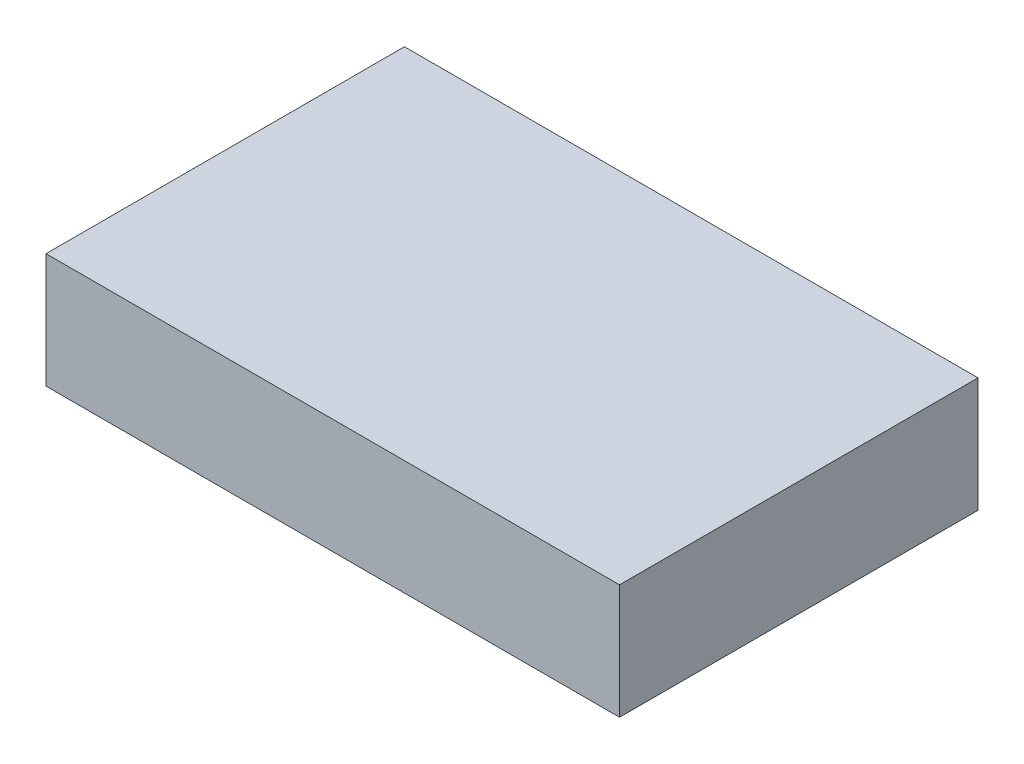
ISO-10303-21;
HEADER;
FILE_DESCRIPTION(('STEP AP214'),'2;1');
FILE_NAME('part.step','',(''),(''),'','','');
FILE_SCHEMA(('AUTOMOTIVE_DESIGN { 1 0 10303 214 1 1 1 1 }'));
ENDSEC;
DATA;
#1=APPLICATION_CONTEXT('core data for automotive mechanical design processes');
#2=APPLICATION_PROTOCOL_DEFINITION('international standard','automotive_design',2000,#1);
#3=PRODUCT_CONTEXT('',#1,'mechanical');
#4=PRODUCT('Part','Part','',(#3));
#5=PRODUCT_RELATED_PRODUCT_CATEGORY('part','',(#4));
#6=PRODUCT_DEFINITION_FORMATION('','',#4);
#7=PRODUCT_DEFINITION_CONTEXT('part definition',#1,'design');
#8=PRODUCT_DEFINITION('design','',#6,#7);
#9=PRODUCT_DEFINITION_SHAPE('','',#8);
#10=(LENGTH_UNIT() NAMED_UNIT(*) SI_UNIT(.MILLI.,.METRE.));
#11=(NAMED_UNIT(*) PLANE_ANGLE_UNIT() SI_UNIT($,.RADIAN.));
#12=(NAMED_UNIT(*) SI_UNIT($,.STERADIAN.) SOLID_ANGLE_UNIT());
#13=UNCERTAINTY_MEASURE_WITH_UNIT(LENGTH_MEASURE(1.E-05),#10,'distance_accuracy_value','');
#14=(GEOMETRIC_REPRESENTATION_CONTEXT(3) GLOBAL_UNCERTAINTY_ASSIGNED_CONTEXT((#13)) GLOBAL_UNIT_ASSIGNED_CONTEXT((#10,
#11,#12)) REPRESENTATION_CONTEXT('',''));
#15=CARTESIAN_POINT('',(0.,0.,0.));
#16=DIRECTION('',(0.,0.,1.));
#17=DIRECTION('',(1.,0.,0.));
#18=AXIS2_PLACEMENT_3D('',#15,#16,#17);
#19=CARTESIAN_POINT('',(0.,3.705,0.));
#20=DIRECTION('',(0.,1.,0.));
#21=DIRECTION('',(1.,0.,0.));
#22=AXIS2_PLACEMENT_3D('',#19,#20,#21);
#23=PLANE('',#22);
#24=DIRECTION('',(-1.,0.,0.));
#25=VECTOR('',#24,1.);
#26=CARTESIAN_POINT('',(0.,3.705,1.861));
#27=LINE('',#26,#25);
#28=CARTESIAN_POINT('',(-13.73,3.705,1.861));
#29=VERTEX_POINT('',#28);
#30=CARTESIAN_POINT('',(-15.73,3.705,1.861));
#31=VERTEX_POINT('',#30);
#32=EDGE_CURVE('E11',#29,#31,#27,.T.);
#33=ORIENTED_EDGE('',*,*,#32,.T.);
#34=DIRECTION('',(0.,0.,1.));
#35=VECTOR('',#34,1.);
#36=CARTESIAN_POINT('',(-15.73,3.705,0.));
#37=LINE('',#36,#35);
#38=CARTESIAN_POINT('',(-15.73,3.705,3.111));
#39=VERTEX_POINT('',#38);
#40=EDGE_CURVE('E24',#31,#39,#37,.T.);
#41=ORIENTED_EDGE('',*,*,#40,.T.);
#42=DIRECTION('',(1.,0.,0.));
#43=VECTOR('',#42,1.);
#44=CARTESIAN_POINT('',(0.,3.705,3.111));
#45=LINE('',#44,#43);
#46=CARTESIAN_POINT('',(-13.73,3.705,3.111));
#47=VERTEX_POINT('',#46);
#48=EDGE_CURVE('E88',#39,#47,#45,.T.);
#49=ORIENTED_EDGE('',*,*,#48,.T.);
#50=DIRECTION('',(0.,0.,-1.));
#51=VECTOR('',#50,1.);
#52=CARTESIAN_POINT('',(-13.73,3.705,0.));
#53=LINE('',#52,#51);
#54=EDGE_CURVE('E59',#47,#29,#53,.T.);
#55=ORIENTED_EDGE('',*,*,#54,.T.);
#56=EDGE_LOOP('',(#33,#41,#49,#55));
#57=FACE_BOUND('',#56,.T.);
#58=ADVANCED_FACE('F17',(#57),#23,.T.);
#59=CARTESIAN_POINT('',(-15.73,3.705,1.861));
#60=DIRECTION('',(1.,0.,0.));
#61=DIRECTION('',(0.,1.,0.));
#62=AXIS2_PLACEMENT_3D('',#59,#60,#61);
#63=PLANE('',#62);
#64=DIRECTION('',(0.,-1.,0.));
#65=VECTOR('',#64,1.);
#66=CARTESIAN_POINT('',(-15.73,3.705,3.111));
#67=LINE('',#66,#65);
#68=CARTESIAN_POINT('',(-15.73,3.305,3.111));
#69=VERTEX_POINT('',#68);
#70=EDGE_CURVE('E75',#39,#69,#67,.T.);
#71=ORIENTED_EDGE('',*,*,#70,.F.);
#72=ORIENTED_EDGE('',*,*,#40,.F.);
#73=DIRECTION('',(0.,1.,0.));
#74=VECTOR('',#73,1.);
#75=CARTESIAN_POINT('',(-15.73,3.705,1.861));
#76=LINE('',#75,#74);
#77=CARTESIAN_POINT('',(-15.73,3.305,1.861));
#78=VERTEX_POINT('',#77);
#79=EDGE_CURVE('E84',#78,#31,#76,.T.);
#80=ORIENTED_EDGE('',*,*,#79,.F.);
#81=DIRECTION('',(0.,0.,1.));
#82=VECTOR('',#81,1.);
#83=CARTESIAN_POINT('',(-15.73,3.305,0.));
#84=LINE('',#83,#82);
#85=EDGE_CURVE('E82',#78,#69,#84,.T.);
#86=ORIENTED_EDGE('',*,*,#85,.T.);
#87=EDGE_LOOP('',(#71,#72,#80,#86));
#88=FACE_BOUND('',#87,.T.);
#89=ADVANCED_FACE('F90',(#88),#63,.F.);
#90=CARTESIAN_POINT('',(-13.73,3.705,1.861));
#91=DIRECTION('',(0.,0.,1.));
#92=DIRECTION('',(1.,0.,0.));
#93=AXIS2_PLACEMENT_3D('',#90,#91,#92);
#94=PLANE('',#93);
#95=ORIENTED_EDGE('',*,*,#79,.T.);
#96=ORIENTED_EDGE('',*,*,#32,.F.);
#97=DIRECTION('',(0.,1.,0.));
#98=VECTOR('',#97,1.);
#99=CARTESIAN_POINT('',(-13.73,3.705,1.861));
#100=LINE('',#99,#98);
#101=CARTESIAN_POINT('',(-13.73,3.305,1.861));
#102=VERTEX_POINT('',#101);
#103=EDGE_CURVE('E80',#102,#29,#100,.T.);
#104=ORIENTED_EDGE('',*,*,#103,.F.);
#105=DIRECTION('',(1.,0.,0.));
#106=VECTOR('',#105,1.);
#107=CARTESIAN_POINT('',(-13.73,3.305,1.861));
#108=LINE('',#107,#106);
#109=EDGE_CURVE('E63',#78,#102,#108,.T.);
#110=ORIENTED_EDGE('',*,*,#109,.F.);
#111=EDGE_LOOP('',(#95,#96,#104,#110));
#112=FACE_BOUND('',#111,.T.);
#113=ADVANCED_FACE('F91',(#112),#94,.F.);
#114=CARTESIAN_POINT('',(-13.73,3.705,3.111));
#115=DIRECTION('',(-1.,0.,0.));
#116=DIRECTION('',(0.,0.,1.));
#117=AXIS2_PLACEMENT_3D('',#114,#115,#116);
#118=PLANE('',#117);
#119=ORIENTED_EDGE('',*,*,#103,.T.);
#120=ORIENTED_EDGE('',*,*,#54,.F.);
#121=DIRECTION('',(0.,1.,0.));
#122=VECTOR('',#121,1.);
#123=CARTESIAN_POINT('',(-13.73,3.705,3.111));
#124=LINE('',#123,#122);
#125=CARTESIAN_POINT('',(-13.73,3.305,3.111));
#126=VERTEX_POINT('',#125);
#127=EDGE_CURVE('E54',#126,#47,#124,.T.);
#128=ORIENTED_EDGE('',*,*,#127,.F.);
#129=DIRECTION('',(0.,0.,1.));
#130=VECTOR('',#129,1.);
#131=CARTESIAN_POINT('',(-13.73,3.305,3.111));
#132=LINE('',#131,#130);
#133=EDGE_CURVE('E58',#102,#126,#132,.T.);
#134=ORIENTED_EDGE('',*,*,#133,.F.);
#135=EDGE_LOOP('',(#119,#120,#128,#134));
#136=FACE_BOUND('',#135,.T.);
#137=ADVANCED_FACE('F57',(#136),#118,.F.);
#138=CARTESIAN_POINT('',(-15.73,3.705,3.111));
#139=DIRECTION('',(0.,0.,-1.));
#140=DIRECTION('',(0.,-1.,0.));
#141=AXIS2_PLACEMENT_3D('',#138,#139,#140);
#142=PLANE('',#141);
#143=ORIENTED_EDGE('',*,*,#127,.T.);
#144=ORIENTED_EDGE('',*,*,#48,.F.);
#145=ORIENTED_EDGE('',*,*,#70,.T.);
#146=DIRECTION('',(-1.,0.,0.));
#147=VECTOR('',#146,1.);
#148=CARTESIAN_POINT('',(-15.73,3.305,3.111));
#149=LINE('',#148,#147);
#150=EDGE_CURVE('E70',#126,#69,#149,.T.);
#151=ORIENTED_EDGE('',*,*,#150,.F.);
#152=EDGE_LOOP('',(#143,#144,#145,#151));
#153=FACE_BOUND('',#152,.T.);
#154=ADVANCED_FACE('F73',(#153),#142,.F.);
#155=CARTESIAN_POINT('',(0.,3.305,0.));
#156=DIRECTION('',(0.,1.,0.));
#157=DIRECTION('',(1.,0.,0.));
#158=AXIS2_PLACEMENT_3D('',#155,#156,#157);
#159=PLANE('',#158);
#160=ORIENTED_EDGE('',*,*,#85,.F.);
#161=ORIENTED_EDGE('',*,*,#109,.T.);
#162=ORIENTED_EDGE('',*,*,#133,.T.);
#163=ORIENTED_EDGE('',*,*,#150,.T.);
#164=EDGE_LOOP('',(#160,#161,#162,#163));
#165=FACE_BOUND('',#164,.T.);
#166=ADVANCED_FACE('F69',(#165),#159,.F.);
#167=CLOSED_SHELL('',(#58,#89,#113,#137,#154,#166));
#168=MANIFOLD_SOLID_BREP('B1',#167);
#169=ADVANCED_BREP_SHAPE_REPRESENTATION('',(#18,#168),#14);
#170=SHAPE_DEFINITION_REPRESENTATION(#9,#169);
ENDSEC;
END-ISO-10303-21;
